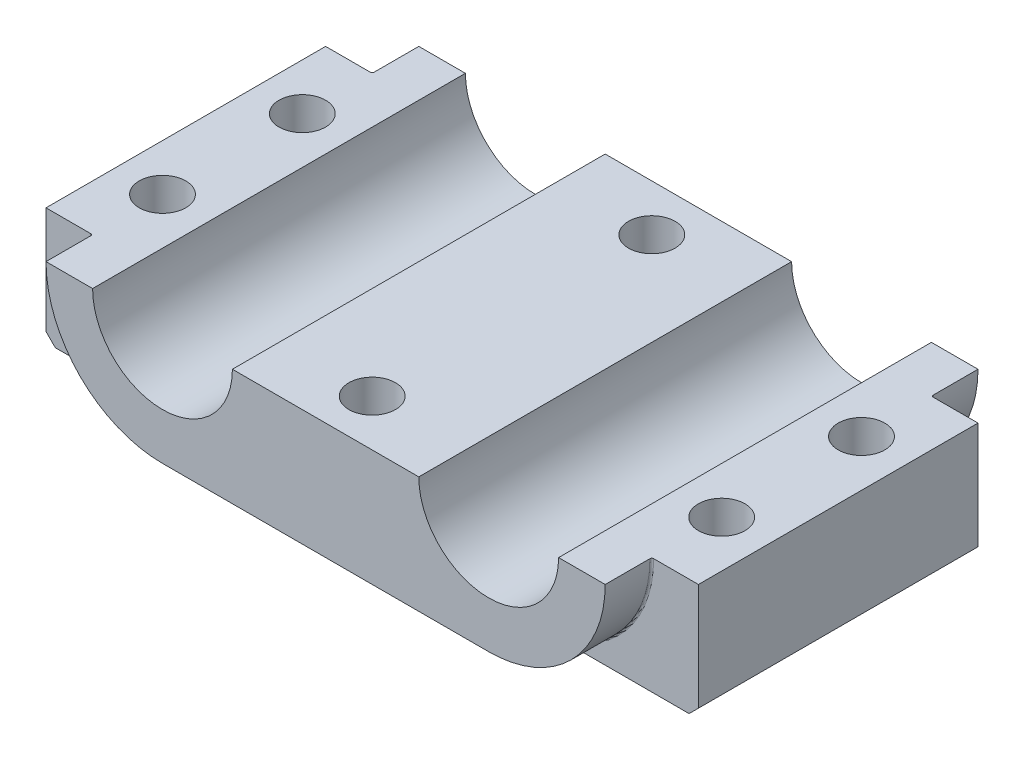
ISO-10303-21;
HEADER;
FILE_DESCRIPTION(('STEP AP214'),'2;1');
FILE_NAME('part.step','',(''),(''),'','','');
FILE_SCHEMA(('AUTOMOTIVE_DESIGN { 1 0 10303 214 1 1 1 1 }'));
ENDSEC;
DATA;
#1=APPLICATION_CONTEXT('core data for automotive mechanical design processes');
#2=APPLICATION_PROTOCOL_DEFINITION('international standard','automotive_design',2000,#1);
#3=PRODUCT_CONTEXT('',#1,'mechanical');
#4=PRODUCT('Part','Part','',(#3));
#5=PRODUCT_RELATED_PRODUCT_CATEGORY('part','',(#4));
#6=PRODUCT_DEFINITION_FORMATION('','',#4);
#7=PRODUCT_DEFINITION_CONTEXT('part definition',#1,'design');
#8=PRODUCT_DEFINITION('design','',#6,#7);
#9=PRODUCT_DEFINITION_SHAPE('','',#8);
#10=(LENGTH_UNIT() NAMED_UNIT(*) SI_UNIT(.MILLI.,.METRE.));
#11=(NAMED_UNIT(*) PLANE_ANGLE_UNIT() SI_UNIT($,.RADIAN.));
#12=(NAMED_UNIT(*) SI_UNIT($,.STERADIAN.) SOLID_ANGLE_UNIT());
#13=UNCERTAINTY_MEASURE_WITH_UNIT(LENGTH_MEASURE(1.E-05),#10,'distance_accuracy_value','');
#14=(GEOMETRIC_REPRESENTATION_CONTEXT(3) GLOBAL_UNCERTAINTY_ASSIGNED_CONTEXT((#13)) GLOBAL_UNIT_ASSIGNED_CONTEXT((#10,
#11,#12)) REPRESENTATION_CONTEXT('',''));
#15=CARTESIAN_POINT('',(0.,0.,0.));
#16=DIRECTION('',(0.,0.,1.));
#17=DIRECTION('',(1.,0.,0.));
#18=AXIS2_PLACEMENT_3D('',#15,#16,#17);
#19=CARTESIAN_POINT('',(17.5,-12.5,-20.));
#20=DIRECTION('',(0.,-1.,0.));
#21=DIRECTION('',(0.,0.,-1.));
#22=AXIS2_PLACEMENT_3D('',#19,#20,#21);
#23=PLANE('',#22);
#24=CARTESIAN_POINT('',(0.,-12.5,-15.));
#25=DIRECTION('',(0.,1.,0.));
#26=DIRECTION('',(0.,0.,1.));
#27=AXIS2_PLACEMENT_3D('',#24,#25,#26);
#28=CIRCLE('',#27,2.5);
#29=CARTESIAN_POINT('',(0.,-12.5,-12.5));
#30=VERTEX_POINT('',#29);
#31=EDGE_CURVE('E480',#30,#30,#28,.T.);
#32=ORIENTED_EDGE('',*,*,#31,.T.);
#33=EDGE_LOOP('',(#32));
#34=FACE_BOUND('',#33,.T.);
#35=CARTESIAN_POINT('',(0.,-12.5,15.));
#36=DIRECTION('',(0.,1.,0.));
#37=DIRECTION('',(0.,0.,1.));
#38=AXIS2_PLACEMENT_3D('',#35,#36,#37);
#39=CIRCLE('',#38,2.5);
#40=CARTESIAN_POINT('',(0.,-12.5,17.5));
#41=VERTEX_POINT('',#40);
#42=EDGE_CURVE('E484',#41,#41,#39,.T.);
#43=ORIENTED_EDGE('',*,*,#42,.T.);
#44=EDGE_LOOP('',(#43));
#45=FACE_BOUND('',#44,.T.);
#46=CARTESIAN_POINT('',(-30.,-12.5,7.50000000000003));
#47=DIRECTION('',(0.,1.,0.));
#48=DIRECTION('',(0.,0.,1.));
#49=AXIS2_PLACEMENT_3D('',#46,#47,#48);
#50=CIRCLE('',#49,2.5);
#51=CARTESIAN_POINT('',(-30.,-12.5,10.));
#52=VERTEX_POINT('',#51);
#53=EDGE_CURVE('E488',#52,#52,#50,.T.);
#54=ORIENTED_EDGE('',*,*,#53,.T.);
#55=EDGE_LOOP('',(#54));
#56=FACE_BOUND('',#55,.T.);
#57=CARTESIAN_POINT('',(30.,-12.5,7.50000000000003));
#58=DIRECTION('',(0.,1.,0.));
#59=DIRECTION('',(0.,0.,1.));
#60=AXIS2_PLACEMENT_3D('',#57,#58,#59);
#61=CIRCLE('',#60,2.5);
#62=CARTESIAN_POINT('',(30.,-12.5,10.));
#63=VERTEX_POINT('',#62);
#64=EDGE_CURVE('E214',#63,#63,#61,.T.);
#65=ORIENTED_EDGE('',*,*,#64,.T.);
#66=EDGE_LOOP('',(#65));
#67=FACE_BOUND('',#66,.T.);
#68=DIRECTION('',(1.,0.,0.));
#69=VECTOR('',#68,1.);
#70=CARTESIAN_POINT('',(-35.,-12.5,15.));
#71=LINE('',#70,#69);
#72=CARTESIAN_POINT('',(-34.,-12.5,15.));
#73=VERTEX_POINT('',#72);
#74=CARTESIAN_POINT('',(-19.7449944320644,-12.5,15.));
#75=VERTEX_POINT('',#74);
#76=EDGE_CURVE('E236',#73,#75,#71,.T.);
#77=ORIENTED_EDGE('',*,*,#76,.F.);
#78=DIRECTION('',(0.,0.,-1.));
#79=VECTOR('',#78,1.);
#80=CARTESIAN_POINT('',(-34.,-12.5,-20.));
#81=LINE('',#80,#79);
#82=CARTESIAN_POINT('',(-34.,-12.5,-15.));
#83=VERTEX_POINT('',#82);
#84=EDGE_CURVE('E332',#73,#83,#81,.T.);
#85=ORIENTED_EDGE('',*,*,#84,.T.);
#86=DIRECTION('',(1.,0.,0.));
#87=VECTOR('',#86,1.);
#88=CARTESIAN_POINT('',(-35.,-12.5,-15.));
#89=LINE('',#88,#87);
#90=CARTESIAN_POINT('',(-19.7449944320644,-12.5,-15.));
#91=VERTEX_POINT('',#90);
#92=EDGE_CURVE('E224',#83,#91,#89,.T.);
#93=ORIENTED_EDGE('',*,*,#92,.T.);
#94=CARTESIAN_POINT('',(-19.7449944320644,-12.5,-15.));
#95=CARTESIAN_POINT('',(-19.6782740769426,-12.5,-15.0000206450152));
#96=CARTESIAN_POINT('',(-19.6115646343148,-12.5,-15.0010401287033));
#97=CARTESIAN_POINT('',(-19.4782238795266,-12.5,-15.0047274040747));
#98=CARTESIAN_POINT('',(-19.4115925448792,-12.5,-15.0073943561905));
#99=CARTESIAN_POINT('',(-19.2116887270352,-12.5,-15.0173501691869));
#100=CARTESIAN_POINT('',(-19.0785161278774,-12.5,-15.0265928090738));
#101=CARTESIAN_POINT('',(-18.8124532512302,-12.5,-15.0485626730138));
#102=CARTESIAN_POINT('',(-18.6795630249036,-12.5,-15.0612904819402));
#103=CARTESIAN_POINT('',(-18.2811128526412,-12.5,-15.1028860141954));
#104=CARTESIAN_POINT('',(-18.01591794903,-12.5,-15.1351557236991));
#105=CARTESIAN_POINT('',(-17.6746293629451,-12.5,-15.1779224548599));
#106=CARTESIAN_POINT('',(-17.5984064291438,-12.5,-15.1875534799209));
#107=CARTESIAN_POINT('',(-17.514789280387,-12.5,-15.1981292657569));
#108=CARTESIAN_POINT('',(-17.5073946433153,-12.5,-15.1990646195097));
#109=CARTESIAN_POINT('',(-17.5,-12.5,-15.2));
#110=B_SPLINE_CURVE_WITH_KNOTS('',3,(#94,#95,#96,#97,#98,#99,#100,#101,#102,#103,#104,#105,#106,
#107,#108,#109),.UNSPECIFIED.,.F.,.F.,(4,2,2,2,2,2,2,4),(0.,0.200137937227426,0.400173966043829,
0.800574859185558,1.20104298792152,2.00241361528082,2.23290310987466,2.25526378964976),.UNSPECIFIED.);
#111=CARTESIAN_POINT('',(-17.5,-12.5,-15.2));
#112=VERTEX_POINT('',#111);
#113=EDGE_CURVE('E370',#91,#112,#110,.T.);
#114=ORIENTED_EDGE('',*,*,#113,.T.);
#115=DIRECTION('',(0.,0.,1.));
#116=VECTOR('',#115,1.);
#117=CARTESIAN_POINT('',(-17.5,-12.5,-20.));
#118=LINE('',#117,#116);
#119=CARTESIAN_POINT('',(-17.5,-12.5,-20.));
#120=VERTEX_POINT('',#119);
#121=EDGE_CURVE('E322',#120,#112,#118,.T.);
#122=ORIENTED_EDGE('',*,*,#121,.F.);
#123=DIRECTION('',(1.,0.,0.));
#124=VECTOR('',#123,1.);
#125=CARTESIAN_POINT('',(17.5,-12.5,-20.));
#126=LINE('',#125,#124);
#127=CARTESIAN_POINT('',(17.5,-12.5,-20.));
#128=VERTEX_POINT('',#127);
#129=EDGE_CURVE('E279',#120,#128,#126,.T.);
#130=ORIENTED_EDGE('',*,*,#129,.T.);
#131=DIRECTION('',(0.,0.,1.));
#132=VECTOR('',#131,1.);
#133=CARTESIAN_POINT('',(17.5,-12.5,-20.));
#134=LINE('',#133,#132);
#135=CARTESIAN_POINT('',(17.5,-12.5,-15.2));
#136=VERTEX_POINT('',#135);
#137=EDGE_CURVE('E318',#128,#136,#134,.T.);
#138=ORIENTED_EDGE('',*,*,#137,.T.);
#139=CARTESIAN_POINT('',(19.7449944320644,-12.5,-15.));
#140=CARTESIAN_POINT('',(19.6782740769426,-12.5,-15.0000206450152));
#141=CARTESIAN_POINT('',(19.6115646343147,-12.5,-15.0010401287033));
#142=CARTESIAN_POINT('',(19.4782238795266,-12.5,-15.0047274040747));
#143=CARTESIAN_POINT('',(19.4115925448792,-12.5,-15.0073943561905));
#144=CARTESIAN_POINT('',(19.2116887270352,-12.5,-15.0173501691869));
#145=CARTESIAN_POINT('',(19.0785161278774,-12.5,-15.0265928090738));
#146=CARTESIAN_POINT('',(18.8124532512302,-12.5,-15.0485626730138));
#147=CARTESIAN_POINT('',(18.6795630249036,-12.5,-15.0612904819402));
#148=CARTESIAN_POINT('',(18.2811128526412,-12.5,-15.1028860141954));
#149=CARTESIAN_POINT('',(18.01591794903,-12.5,-15.1351557236991));
#150=CARTESIAN_POINT('',(17.6746293629451,-12.5,-15.1779224548599));
#151=CARTESIAN_POINT('',(17.5984064291438,-12.5,-15.1875534799209));
#152=CARTESIAN_POINT('',(17.514789280387,-12.5,-15.1981292657569));
#153=CARTESIAN_POINT('',(17.5073946433153,-12.5,-15.1990646195097));
#154=CARTESIAN_POINT('',(17.5,-12.5,-15.2));
#155=B_SPLINE_CURVE_WITH_KNOTS('',3,(#139,#140,#141,#142,#143,#144,#145,#146,#147,#148,#149,
#150,#151,#152,#153,#154),.UNSPECIFIED.,.F.,.F.,(4,2,2,2,2,2,2,4),(0.,0.200137937227426,
0.400173966043826,0.800574859185555,1.20104298792152,2.00241361528082,2.23290310987462,
2.25526378964973),.UNSPECIFIED.);
#156=CARTESIAN_POINT('',(19.7449944320644,-12.5,-15.));
#157=VERTEX_POINT('',#156);
#158=EDGE_CURVE('E363',#136,#157,#155,.F.);
#159=ORIENTED_EDGE('',*,*,#158,.T.);
#160=CARTESIAN_POINT('',(34.,-12.5,-15.));
#161=VERTEX_POINT('',#160);
#162=EDGE_CURVE('E247',#157,#161,#89,.T.);
#163=ORIENTED_EDGE('',*,*,#162,.T.);
#164=DIRECTION('',(0.,0.,1.));
#165=VECTOR('',#164,1.);
#166=CARTESIAN_POINT('',(34.,-12.5,-20.));
#167=LINE('',#166,#165);
#168=CARTESIAN_POINT('',(34.,-12.5,15.));
#169=VERTEX_POINT('',#168);
#170=EDGE_CURVE('E329',#161,#169,#167,.T.);
#171=ORIENTED_EDGE('',*,*,#170,.T.);
#172=CARTESIAN_POINT('',(19.7449944320644,-12.5,15.));
#173=VERTEX_POINT('',#172);
#174=EDGE_CURVE('E235',#173,#169,#71,.T.);
#175=ORIENTED_EDGE('',*,*,#174,.F.);
#176=CARTESIAN_POINT('',(19.7449944320644,-12.5,15.));
#177=CARTESIAN_POINT('',(19.6782740769426,-12.5,15.0000206450153));
#178=CARTESIAN_POINT('',(19.6115646343147,-12.5,15.0010401287033));
#179=CARTESIAN_POINT('',(19.4782238795266,-12.5,15.0047274040748));
#180=CARTESIAN_POINT('',(19.4115925448792,-12.5,15.0073943561905));
#181=CARTESIAN_POINT('',(19.2116887270352,-12.5,15.017350169187));
#182=CARTESIAN_POINT('',(19.0785161278774,-12.5,15.0265928090738));
#183=CARTESIAN_POINT('',(18.8124532512302,-12.5,15.0485626730139));
#184=CARTESIAN_POINT('',(18.6795630249036,-12.5,15.0612904819402));
#185=CARTESIAN_POINT('',(18.2811128526412,-12.5,15.1028860141954));
#186=CARTESIAN_POINT('',(18.01591794903,-12.5,15.1351557236991));
#187=CARTESIAN_POINT('',(17.6746293629451,-12.5,15.17792245486));
#188=CARTESIAN_POINT('',(17.5984064291438,-12.5,15.1875534799209));
#189=CARTESIAN_POINT('',(17.514789280387,-12.5,15.1981292657569));
#190=CARTESIAN_POINT('',(17.5073946433153,-12.5,15.1990646195097));
#191=CARTESIAN_POINT('',(17.5,-12.5,15.2));
#192=B_SPLINE_CURVE_WITH_KNOTS('',3,(#176,#177,#178,#179,#180,#181,#182,#183,#184,#185,#186,
#187,#188,#189,#190,#191),.UNSPECIFIED.,.F.,.F.,(4,2,2,2,2,2,2,4),(0.,0.200137937227423,
0.400173966043826,0.800574859185558,1.20104298792152,2.00241361528082,2.23290310987462,
2.25526378964973),.UNSPECIFIED.);
#193=CARTESIAN_POINT('',(17.5,-12.5,15.2));
#194=VERTEX_POINT('',#193);
#195=EDGE_CURVE('E13',#173,#194,#192,.T.);
#196=ORIENTED_EDGE('',*,*,#195,.T.);
#197=CARTESIAN_POINT('',(17.5,-12.5,20.));
#198=VERTEX_POINT('',#197);
#199=EDGE_CURVE('E321',#194,#198,#134,.T.);
#200=ORIENTED_EDGE('',*,*,#199,.T.);
#201=DIRECTION('',(1.,0.,0.));
#202=VECTOR('',#201,1.);
#203=CARTESIAN_POINT('',(17.5,-12.5,20.));
#204=LINE('',#203,#202);
#205=CARTESIAN_POINT('',(-17.5,-12.5,20.));
#206=VERTEX_POINT('',#205);
#207=EDGE_CURVE('E255',#206,#198,#204,.T.);
#208=ORIENTED_EDGE('',*,*,#207,.F.);
#209=CARTESIAN_POINT('',(-17.5,-12.5,15.2));
#210=VERTEX_POINT('',#209);
#211=EDGE_CURVE('E300',#210,#206,#118,.T.);
#212=ORIENTED_EDGE('',*,*,#211,.F.);
#213=CARTESIAN_POINT('',(-19.7449944320644,-12.5,15.));
#214=CARTESIAN_POINT('',(-19.6782740769426,-12.5,15.0000206450153));
#215=CARTESIAN_POINT('',(-19.6115646343148,-12.5,15.0010401287033));
#216=CARTESIAN_POINT('',(-19.4782238795266,-12.5,15.0047274040748));
#217=CARTESIAN_POINT('',(-19.4115925448792,-12.5,15.0073943561905));
#218=CARTESIAN_POINT('',(-19.2116887270352,-12.5,15.0173501691869));
#219=CARTESIAN_POINT('',(-19.0785161278774,-12.5,15.0265928090738));
#220=CARTESIAN_POINT('',(-18.8124532512302,-12.5,15.0485626730139));
#221=CARTESIAN_POINT('',(-18.6795630249036,-12.5,15.0612904819402));
#222=CARTESIAN_POINT('',(-18.2811128526412,-12.5,15.1028860141954));
#223=CARTESIAN_POINT('',(-18.01591794903,-12.5,15.1351557236991));
#224=CARTESIAN_POINT('',(-17.6746293629451,-12.5,15.17792245486));
#225=CARTESIAN_POINT('',(-17.5984064291438,-12.5,15.1875534799209));
#226=CARTESIAN_POINT('',(-17.514789280387,-12.5,15.1981292657569));
#227=CARTESIAN_POINT('',(-17.5073946433153,-12.5,15.1990646195097));
#228=CARTESIAN_POINT('',(-17.5,-12.5,15.2));
#229=B_SPLINE_CURVE_WITH_KNOTS('',3,(#213,#214,#215,#216,#217,#218,#219,#220,#221,#222,#223,
#224,#225,#226,#227,#228),.UNSPECIFIED.,.F.,.F.,(4,2,2,2,2,2,2,4),(0.,0.200137937227426,
0.400173966043829,0.800574859185558,1.20104298792152,2.00241361528082,2.23290310987466,
2.25526378964976),.UNSPECIFIED.);
#230=EDGE_CURVE('E398',#210,#75,#229,.F.);
#231=ORIENTED_EDGE('',*,*,#230,.T.);
#232=EDGE_LOOP('',(#77,#85,#93,#114,#122,#130,#138,#159,#163,#171,#175,#196,#200,#208,#212,#231));
#233=FACE_BOUND('',#232,.T.);
#234=CARTESIAN_POINT('',(30.,-12.5,-7.50000000000001));
#235=DIRECTION('',(0.,1.,0.));
#236=DIRECTION('',(0.,0.,1.));
#237=AXIS2_PLACEMENT_3D('',#234,#235,#236);
#238=CIRCLE('',#237,2.5);
#239=CARTESIAN_POINT('',(30.,-12.5,-5.00000000000001));
#240=VERTEX_POINT('',#239);
#241=EDGE_CURVE('E494',#240,#240,#238,.T.);
#242=ORIENTED_EDGE('',*,*,#241,.T.);
#243=EDGE_LOOP('',(#242));
#244=FACE_BOUND('',#243,.T.);
#245=CARTESIAN_POINT('',(-30.,-12.5,-7.50000000000001));
#246=DIRECTION('',(0.,1.,0.));
#247=DIRECTION('',(0.,0.,1.));
#248=AXIS2_PLACEMENT_3D('',#245,#246,#247);
#249=CIRCLE('',#248,2.5);
#250=CARTESIAN_POINT('',(-30.,-12.5,-5.00000000000001));
#251=VERTEX_POINT('',#250);
#252=EDGE_CURVE('E502',#251,#251,#249,.T.);
#253=ORIENTED_EDGE('',*,*,#252,.T.);
#254=EDGE_LOOP('',(#253));
#255=FACE_BOUND('',#254,.T.);
#256=ADVANCED_FACE('F54',(#34,#45,#56,#67,#233,#244,#255),#23,.T.);
#257=CARTESIAN_POINT('',(-17.5,0.,-20.));
#258=DIRECTION('',(0.,0.,1.));
#259=DIRECTION('',(1.,0.,0.));
#260=AXIS2_PLACEMENT_3D('',#257,#258,#259);
#261=CYLINDRICAL_SURFACE('',#260,12.5);
#262=DIRECTION('',(0.,0.,1.));
#263=VECTOR('',#262,1.);
#264=CARTESIAN_POINT('',(-30.,0.,-20.));
#265=LINE('',#264,#263);
#266=CARTESIAN_POINT('',(-30.,0.,15.2));
#267=VERTEX_POINT('',#266);
#268=CARTESIAN_POINT('',(-30.,0.,20.));
#269=VERTEX_POINT('',#268);
#270=EDGE_CURVE('E305',#267,#269,#265,.T.);
#271=ORIENTED_EDGE('',*,*,#270,.F.);
#272=CARTESIAN_POINT('',(-17.5,0.,15.2));
#273=DIRECTION('',(0.,0.,-1.));
#274=DIRECTION('',(-1.,0.,0.));
#275=AXIS2_PLACEMENT_3D('',#272,#273,#274);
#276=CIRCLE('',#275,12.5);
#277=EDGE_CURVE('E352',#267,#210,#276,.F.);
#278=ORIENTED_EDGE('',*,*,#277,.T.);
#279=ORIENTED_EDGE('',*,*,#211,.T.);
#280=CARTESIAN_POINT('',(-17.5,0.,20.));
#281=DIRECTION('',(0.,0.,1.));
#282=DIRECTION('',(-1.,0.,0.));
#283=AXIS2_PLACEMENT_3D('',#280,#281,#282);
#284=CIRCLE('',#283,12.5);
#285=EDGE_CURVE('E251',#269,#206,#284,.T.);
#286=ORIENTED_EDGE('',*,*,#285,.F.);
#287=EDGE_LOOP('',(#271,#278,#279,#286));
#288=FACE_BOUND('',#287,.T.);
#289=ADVANCED_FACE('F416',(#288),#261,.T.);
#290=CARTESIAN_POINT('',(17.5,0.,-20.));
#291=DIRECTION('',(0.,0.,1.));
#292=DIRECTION('',(1.,0.,0.));
#293=AXIS2_PLACEMENT_3D('',#290,#291,#292);
#294=CYLINDRICAL_SURFACE('',#293,12.5);
#295=ORIENTED_EDGE('',*,*,#199,.F.);
#296=CARTESIAN_POINT('',(17.5,0.,15.2));
#297=DIRECTION('',(0.,0.,-1.));
#298=DIRECTION('',(-1.,0.,0.));
#299=AXIS2_PLACEMENT_3D('',#296,#297,#298);
#300=CIRCLE('',#299,12.5);
#301=CARTESIAN_POINT('',(30.,0.,15.2));
#302=VERTEX_POINT('',#301);
#303=EDGE_CURVE('E357',#194,#302,#300,.F.);
#304=ORIENTED_EDGE('',*,*,#303,.T.);
#305=DIRECTION('',(0.,0.,1.));
#306=VECTOR('',#305,1.);
#307=CARTESIAN_POINT('',(30.,0.,-20.));
#308=LINE('',#307,#306);
#309=CARTESIAN_POINT('',(30.,0.,20.));
#310=VERTEX_POINT('',#309);
#311=EDGE_CURVE('E317',#302,#310,#308,.T.);
#312=ORIENTED_EDGE('',*,*,#311,.T.);
#313=CARTESIAN_POINT('',(17.5,0.,20.));
#314=DIRECTION('',(0.,0.,1.));
#315=DIRECTION('',(1.,0.,0.));
#316=AXIS2_PLACEMENT_3D('',#313,#314,#315);
#317=CIRCLE('',#316,12.5);
#318=EDGE_CURVE('E258',#198,#310,#317,.T.);
#319=ORIENTED_EDGE('',*,*,#318,.F.);
#320=EDGE_LOOP('',(#295,#304,#312,#319));
#321=FACE_BOUND('',#320,.T.);
#322=ADVANCED_FACE('F460',(#321),#294,.T.);
#323=ORIENTED_EDGE('',*,*,#121,.T.);
#324=CARTESIAN_POINT('',(-17.5,0.,-15.2));
#325=DIRECTION('',(0.,0.,-1.));
#326=DIRECTION('',(-1.,0.,0.));
#327=AXIS2_PLACEMENT_3D('',#324,#325,#326);
#328=CIRCLE('',#327,12.5);
#329=CARTESIAN_POINT('',(-30.,0.,-15.2));
#330=VERTEX_POINT('',#329);
#331=EDGE_CURVE('E350',#112,#330,#328,.T.);
#332=ORIENTED_EDGE('',*,*,#331,.T.);
#333=CARTESIAN_POINT('',(-30.,0.,-20.));
#334=VERTEX_POINT('',#333);
#335=EDGE_CURVE('E301',#334,#330,#265,.T.);
#336=ORIENTED_EDGE('',*,*,#335,.F.);
#337=CARTESIAN_POINT('',(-17.5,0.,-20.));
#338=DIRECTION('',(0.,0.,1.));
#339=DIRECTION('',(-1.,0.,0.));
#340=AXIS2_PLACEMENT_3D('',#337,#338,#339);
#341=CIRCLE('',#340,12.5);
#342=EDGE_CURVE('E276',#334,#120,#341,.T.);
#343=ORIENTED_EDGE('',*,*,#342,.T.);
#344=EDGE_LOOP('',(#323,#332,#336,#343));
#345=FACE_BOUND('',#344,.T.);
#346=ADVANCED_FACE('F442',(#345),#261,.T.);
#347=CARTESIAN_POINT('',(-25.,0.,-20.));
#348=DIRECTION('',(0.,1.,0.));
#349=DIRECTION('',(0.,0.,1.));
#350=AXIS2_PLACEMENT_3D('',#347,#348,#349);
#351=PLANE('',#350);
#352=CARTESIAN_POINT('',(-30.,0.,7.50000000000003));
#353=DIRECTION('',(0.,1.,0.));
#354=DIRECTION('',(0.,0.,1.));
#355=AXIS2_PLACEMENT_3D('',#352,#353,#354);
#356=CIRCLE('',#355,2.49999999999999);
#357=CARTESIAN_POINT('',(-30.,0.,10.));
#358=VERTEX_POINT('',#357);
#359=EDGE_CURVE('E509',#358,#358,#356,.T.);
#360=ORIENTED_EDGE('',*,*,#359,.F.);
#361=EDGE_LOOP('',(#360));
#362=FACE_BOUND('',#361,.T.);
#363=CARTESIAN_POINT('',(-30.,0.,-7.50000000000001));
#364=DIRECTION('',(0.,1.,0.));
#365=DIRECTION('',(0.,0.,1.));
#366=AXIS2_PLACEMENT_3D('',#363,#364,#365);
#367=CIRCLE('',#366,2.49999999999999);
#368=CARTESIAN_POINT('',(-30.,0.,-5.00000000000002));
#369=VERTEX_POINT('',#368);
#370=EDGE_CURVE('E505',#369,#369,#367,.T.);
#371=ORIENTED_EDGE('',*,*,#370,.F.);
#372=EDGE_LOOP('',(#371));
#373=FACE_BOUND('',#372,.T.);
#374=ORIENTED_EDGE('',*,*,#335,.T.);
#375=CARTESIAN_POINT('',(-30.2,0.,-15.2));
#376=DIRECTION('',(0.,1.,0.));
#377=DIRECTION('',(0.,0.,1.));
#378=AXIS2_PLACEMENT_3D('',#375,#376,#377);
#379=CIRCLE('',#378,0.2);
#380=CARTESIAN_POINT('',(-30.2,0.,-15.));
#381=VERTEX_POINT('',#380);
#382=EDGE_CURVE('E405',#330,#381,#379,.F.);
#383=ORIENTED_EDGE('',*,*,#382,.T.);
#384=DIRECTION('',(-1.,0.,0.));
#385=VECTOR('',#384,1.);
#386=CARTESIAN_POINT('',(-25.,0.,-15.));
#387=LINE('',#386,#385);
#388=CARTESIAN_POINT('',(-35.,0.,-15.));
#389=VERTEX_POINT('',#388);
#390=EDGE_CURVE('E242',#381,#389,#387,.T.);
#391=ORIENTED_EDGE('',*,*,#390,.T.);
#392=DIRECTION('',(0.,0.,1.));
#393=VECTOR('',#392,1.);
#394=CARTESIAN_POINT('',(-35.,0.,-15.));
#395=LINE('',#394,#393);
#396=CARTESIAN_POINT('',(-35.,0.,15.));
#397=VERTEX_POINT('',#396);
#398=EDGE_CURVE('E223',#389,#397,#395,.T.);
#399=ORIENTED_EDGE('',*,*,#398,.T.);
#400=DIRECTION('',(-1.,0.,0.));
#401=VECTOR('',#400,1.);
#402=CARTESIAN_POINT('',(-25.,0.,15.));
#403=LINE('',#402,#401);
#404=CARTESIAN_POINT('',(-30.2,0.,15.));
#405=VERTEX_POINT('',#404);
#406=EDGE_CURVE('E227',#405,#397,#403,.T.);
#407=ORIENTED_EDGE('',*,*,#406,.F.);
#408=CARTESIAN_POINT('',(-30.2,0.,15.2));
#409=DIRECTION('',(0.,1.,0.));
#410=DIRECTION('',(0.,0.,1.));
#411=AXIS2_PLACEMENT_3D('',#408,#409,#410);
#412=CIRCLE('',#411,0.2);
#413=EDGE_CURVE('E404',#405,#267,#412,.F.);
#414=ORIENTED_EDGE('',*,*,#413,.T.);
#415=ORIENTED_EDGE('',*,*,#270,.T.);
#416=DIRECTION('',(-1.,0.,0.));
#417=VECTOR('',#416,1.);
#418=CARTESIAN_POINT('',(-25.,0.,20.));
#419=LINE('',#418,#417);
#420=CARTESIAN_POINT('',(-25.,0.,20.));
#421=VERTEX_POINT('',#420);
#422=EDGE_CURVE('E273',#421,#269,#419,.T.);
#423=ORIENTED_EDGE('',*,*,#422,.F.);
#424=DIRECTION('',(0.,0.,1.));
#425=VECTOR('',#424,1.);
#426=CARTESIAN_POINT('',(-25.,0.,-20.));
#427=LINE('',#426,#425);
#428=CARTESIAN_POINT('',(-25.,0.,-20.));
#429=VERTEX_POINT('',#428);
#430=EDGE_CURVE('E306',#429,#421,#427,.T.);
#431=ORIENTED_EDGE('',*,*,#430,.F.);
#432=DIRECTION('',(-1.,0.,0.));
#433=VECTOR('',#432,1.);
#434=CARTESIAN_POINT('',(-25.,0.,-20.));
#435=LINE('',#434,#433);
#436=EDGE_CURVE('E297',#429,#334,#435,.T.);
#437=ORIENTED_EDGE('',*,*,#436,.T.);
#438=EDGE_LOOP('',(#374,#383,#391,#399,#407,#414,#415,#423,#431,#437));
#439=FACE_BOUND('',#438,.T.);
#440=ADVANCED_FACE('F410',(#362,#373,#439),#351,.T.);
#441=CARTESIAN_POINT('',(-17.5,0.,-20.));
#442=DIRECTION('',(0.,0.,1.));
#443=DIRECTION('',(1.,0.,0.));
#444=AXIS2_PLACEMENT_3D('',#441,#442,#443);
#445=CYLINDRICAL_SURFACE('',#444,7.5);
#446=ORIENTED_EDGE('',*,*,#430,.T.);
#447=CARTESIAN_POINT('',(-17.5,0.,20.));
#448=DIRECTION('',(0.,0.,-1.));
#449=DIRECTION('',(-1.,0.,0.));
#450=AXIS2_PLACEMENT_3D('',#447,#448,#449);
#451=CIRCLE('',#450,7.5);
#452=CARTESIAN_POINT('',(-10.,0.,20.));
#453=VERTEX_POINT('',#452);
#454=EDGE_CURVE('E270',#453,#421,#451,.T.);
#455=ORIENTED_EDGE('',*,*,#454,.F.);
#456=DIRECTION('',(0.,0.,1.));
#457=VECTOR('',#456,1.);
#458=CARTESIAN_POINT('',(-10.,0.,-20.));
#459=LINE('',#458,#457);
#460=CARTESIAN_POINT('',(-10.,0.,-20.));
#461=VERTEX_POINT('',#460);
#462=EDGE_CURVE('E308',#461,#453,#459,.T.);
#463=ORIENTED_EDGE('',*,*,#462,.F.);
#464=CARTESIAN_POINT('',(-17.5,0.,-20.));
#465=DIRECTION('',(0.,0.,-1.));
#466=DIRECTION('',(-1.,0.,0.));
#467=AXIS2_PLACEMENT_3D('',#464,#465,#466);
#468=CIRCLE('',#467,7.5);
#469=EDGE_CURVE('E294',#461,#429,#468,.T.);
#470=ORIENTED_EDGE('',*,*,#469,.T.);
#471=EDGE_LOOP('',(#446,#455,#463,#470));
#472=FACE_BOUND('',#471,.T.);
#473=ADVANCED_FACE('F525',(#472),#445,.F.);
#474=CARTESIAN_POINT('',(-10.,0.,-20.));
#475=DIRECTION('',(0.,1.,0.));
#476=DIRECTION('',(0.,0.,1.));
#477=AXIS2_PLACEMENT_3D('',#474,#475,#476);
#478=PLANE('',#477);
#479=CARTESIAN_POINT('',(0.,0.,-15.));
#480=DIRECTION('',(0.,1.,0.));
#481=DIRECTION('',(0.,0.,1.));
#482=AXIS2_PLACEMENT_3D('',#479,#480,#481);
#483=CIRCLE('',#482,2.49999999999999);
#484=CARTESIAN_POINT('',(0.,0.,-12.5));
#485=VERTEX_POINT('',#484);
#486=EDGE_CURVE('E517',#485,#485,#483,.T.);
#487=ORIENTED_EDGE('',*,*,#486,.F.);
#488=EDGE_LOOP('',(#487));
#489=FACE_BOUND('',#488,.T.);
#490=CARTESIAN_POINT('',(0.,0.,15.));
#491=DIRECTION('',(0.,1.,0.));
#492=DIRECTION('',(0.,0.,1.));
#493=AXIS2_PLACEMENT_3D('',#490,#491,#492);
#494=CIRCLE('',#493,2.49999999999999);
#495=CARTESIAN_POINT('',(0.,0.,17.5));
#496=VERTEX_POINT('',#495);
#497=EDGE_CURVE('E513',#496,#496,#494,.T.);
#498=ORIENTED_EDGE('',*,*,#497,.F.);
#499=EDGE_LOOP('',(#498));
#500=FACE_BOUND('',#499,.T.);
#501=ORIENTED_EDGE('',*,*,#462,.T.);
#502=DIRECTION('',(-1.,0.,0.));
#503=VECTOR('',#502,1.);
#504=CARTESIAN_POINT('',(-10.,0.,20.));
#505=LINE('',#504,#503);
#506=CARTESIAN_POINT('',(10.,0.,20.));
#507=VERTEX_POINT('',#506);
#508=EDGE_CURVE('E267',#507,#453,#505,.T.);
#509=ORIENTED_EDGE('',*,*,#508,.F.);
#510=DIRECTION('',(0.,0.,1.));
#511=VECTOR('',#510,1.);
#512=CARTESIAN_POINT('',(10.,0.,-20.));
#513=LINE('',#512,#511);
#514=CARTESIAN_POINT('',(10.,0.,-20.));
#515=VERTEX_POINT('',#514);
#516=EDGE_CURVE('E310',#515,#507,#513,.T.);
#517=ORIENTED_EDGE('',*,*,#516,.F.);
#518=DIRECTION('',(-1.,0.,0.));
#519=VECTOR('',#518,1.);
#520=CARTESIAN_POINT('',(-10.,0.,-20.));
#521=LINE('',#520,#519);
#522=EDGE_CURVE('E291',#515,#461,#521,.T.);
#523=ORIENTED_EDGE('',*,*,#522,.T.);
#524=EDGE_LOOP('',(#501,#509,#517,#523));
#525=FACE_BOUND('',#524,.T.);
#526=ADVANCED_FACE('F522',(#489,#500,#525),#478,.T.);
#527=CARTESIAN_POINT('',(17.5,0.,-20.));
#528=DIRECTION('',(0.,0.,1.));
#529=DIRECTION('',(1.,0.,0.));
#530=AXIS2_PLACEMENT_3D('',#527,#528,#529);
#531=CYLINDRICAL_SURFACE('',#530,7.5);
#532=ORIENTED_EDGE('',*,*,#516,.T.);
#533=CARTESIAN_POINT('',(17.5,0.,20.));
#534=DIRECTION('',(0.,0.,-1.));
#535=DIRECTION('',(1.,0.,0.));
#536=AXIS2_PLACEMENT_3D('',#533,#534,#535);
#537=CIRCLE('',#536,7.5);
#538=CARTESIAN_POINT('',(25.,0.,20.));
#539=VERTEX_POINT('',#538);
#540=EDGE_CURVE('E264',#539,#507,#537,.T.);
#541=ORIENTED_EDGE('',*,*,#540,.F.);
#542=DIRECTION('',(0.,0.,1.));
#543=VECTOR('',#542,1.);
#544=CARTESIAN_POINT('',(25.,0.,-20.));
#545=LINE('',#544,#543);
#546=CARTESIAN_POINT('',(25.,0.,-20.));
#547=VERTEX_POINT('',#546);
#548=EDGE_CURVE('E312',#547,#539,#545,.T.);
#549=ORIENTED_EDGE('',*,*,#548,.F.);
#550=CARTESIAN_POINT('',(17.5,0.,-20.));
#551=DIRECTION('',(0.,0.,-1.));
#552=DIRECTION('',(1.,0.,0.));
#553=AXIS2_PLACEMENT_3D('',#550,#551,#552);
#554=CIRCLE('',#553,7.5);
#555=EDGE_CURVE('E288',#547,#515,#554,.T.);
#556=ORIENTED_EDGE('',*,*,#555,.T.);
#557=EDGE_LOOP('',(#532,#541,#549,#556));
#558=FACE_BOUND('',#557,.T.);
#559=ADVANCED_FACE('F467',(#558),#531,.F.);
#560=CARTESIAN_POINT('',(25.,0.,-20.));
#561=DIRECTION('',(0.,1.,0.));
#562=DIRECTION('',(0.,0.,1.));
#563=AXIS2_PLACEMENT_3D('',#560,#561,#562);
#564=PLANE('',#563);
#565=CARTESIAN_POINT('',(30.,0.,-7.50000000000001));
#566=DIRECTION('',(0.,1.,0.));
#567=DIRECTION('',(0.,0.,1.));
#568=AXIS2_PLACEMENT_3D('',#565,#566,#567);
#569=CIRCLE('',#568,2.49999999999999);
#570=CARTESIAN_POINT('',(30.,0.,-5.00000000000002));
#571=VERTEX_POINT('',#570);
#572=EDGE_CURVE('E499',#571,#571,#569,.T.);
#573=ORIENTED_EDGE('',*,*,#572,.F.);
#574=EDGE_LOOP('',(#573));
#575=FACE_BOUND('',#574,.T.);
#576=CARTESIAN_POINT('',(30.,0.,7.50000000000003));
#577=DIRECTION('',(0.,1.,0.));
#578=DIRECTION('',(0.,0.,1.));
#579=AXIS2_PLACEMENT_3D('',#576,#577,#578);
#580=CIRCLE('',#579,2.49999999999999);
#581=CARTESIAN_POINT('',(30.,0.,10.));
#582=VERTEX_POINT('',#581);
#583=EDGE_CURVE('E492',#582,#582,#580,.T.);
#584=ORIENTED_EDGE('',*,*,#583,.F.);
#585=EDGE_LOOP('',(#584));
#586=FACE_BOUND('',#585,.T.);
#587=ORIENTED_EDGE('',*,*,#548,.T.);
#588=DIRECTION('',(-1.,0.,0.));
#589=VECTOR('',#588,1.);
#590=CARTESIAN_POINT('',(25.,0.,20.));
#591=LINE('',#590,#589);
#592=EDGE_CURVE('E261',#310,#539,#591,.T.);
#593=ORIENTED_EDGE('',*,*,#592,.F.);
#594=ORIENTED_EDGE('',*,*,#311,.F.);
#595=CARTESIAN_POINT('',(30.2,0.,15.2));
#596=DIRECTION('',(0.,1.,0.));
#597=DIRECTION('',(0.,0.,1.));
#598=AXIS2_PLACEMENT_3D('',#595,#596,#597);
#599=CIRCLE('',#598,0.2);
#600=CARTESIAN_POINT('',(30.2,0.,15.));
#601=VERTEX_POINT('',#600);
#602=EDGE_CURVE('E68',#302,#601,#599,.F.);
#603=ORIENTED_EDGE('',*,*,#602,.T.);
#604=DIRECTION('',(-1.,0.,0.));
#605=VECTOR('',#604,1.);
#606=CARTESIAN_POINT('',(30.,0.,15.));
#607=LINE('',#606,#605);
#608=CARTESIAN_POINT('',(35.,0.,15.));
#609=VERTEX_POINT('',#608);
#610=EDGE_CURVE('E209',#609,#601,#607,.T.);
#611=ORIENTED_EDGE('',*,*,#610,.F.);
#612=DIRECTION('',(0.,0.,1.));
#613=VECTOR('',#612,1.);
#614=CARTESIAN_POINT('',(35.,0.,-15.));
#615=LINE('',#614,#613);
#616=CARTESIAN_POINT('',(35.,0.,-15.));
#617=VERTEX_POINT('',#616);
#618=EDGE_CURVE('E217',#617,#609,#615,.T.);
#619=ORIENTED_EDGE('',*,*,#618,.F.);
#620=DIRECTION('',(-1.,0.,0.));
#621=VECTOR('',#620,1.);
#622=CARTESIAN_POINT('',(30.,0.,-15.));
#623=LINE('',#622,#621);
#624=CARTESIAN_POINT('',(30.2,0.,-15.));
#625=VERTEX_POINT('',#624);
#626=EDGE_CURVE('E240',#617,#625,#623,.T.);
#627=ORIENTED_EDGE('',*,*,#626,.T.);
#628=CARTESIAN_POINT('',(30.2,0.,-15.2));
#629=DIRECTION('',(0.,1.,0.));
#630=DIRECTION('',(0.,0.,1.));
#631=AXIS2_PLACEMENT_3D('',#628,#629,#630);
#632=CIRCLE('',#631,0.2);
#633=CARTESIAN_POINT('',(30.,0.,-15.2));
#634=VERTEX_POINT('',#633);
#635=EDGE_CURVE('E361',#625,#634,#632,.F.);
#636=ORIENTED_EDGE('',*,*,#635,.T.);
#637=CARTESIAN_POINT('',(30.,0.,-20.));
#638=VERTEX_POINT('',#637);
#639=EDGE_CURVE('E314',#638,#634,#308,.T.);
#640=ORIENTED_EDGE('',*,*,#639,.F.);
#641=DIRECTION('',(-1.,0.,0.));
#642=VECTOR('',#641,1.);
#643=CARTESIAN_POINT('',(25.,0.,-20.));
#644=LINE('',#643,#642);
#645=EDGE_CURVE('E285',#638,#547,#644,.T.);
#646=ORIENTED_EDGE('',*,*,#645,.T.);
#647=EDGE_LOOP('',(#587,#593,#594,#603,#611,#619,#627,#636,#640,#646));
#648=FACE_BOUND('',#647,.T.);
#649=ADVANCED_FACE('F226',(#575,#586,#648),#564,.T.);
#650=ORIENTED_EDGE('',*,*,#639,.T.);
#651=CARTESIAN_POINT('',(17.5,0.,-15.2));
#652=DIRECTION('',(0.,0.,-1.));
#653=DIRECTION('',(-1.,0.,0.));
#654=AXIS2_PLACEMENT_3D('',#651,#652,#653);
#655=CIRCLE('',#654,12.5);
#656=EDGE_CURVE('E345',#634,#136,#655,.T.);
#657=ORIENTED_EDGE('',*,*,#656,.T.);
#658=ORIENTED_EDGE('',*,*,#137,.F.);
#659=CARTESIAN_POINT('',(17.5,0.,-20.));
#660=DIRECTION('',(0.,0.,1.));
#661=DIRECTION('',(1.,0.,0.));
#662=AXIS2_PLACEMENT_3D('',#659,#660,#661);
#663=CIRCLE('',#662,12.5);
#664=EDGE_CURVE('E282',#128,#638,#663,.T.);
#665=ORIENTED_EDGE('',*,*,#664,.T.);
#666=EDGE_LOOP('',(#650,#657,#658,#665));
#667=FACE_BOUND('',#666,.T.);
#668=ADVANCED_FACE('F458',(#667),#294,.T.);
#669=CARTESIAN_POINT('',(-17.5,0.,-20.));
#670=DIRECTION('',(0.,0.,-1.));
#671=DIRECTION('',(-1.,0.,0.));
#672=AXIS2_PLACEMENT_3D('',#669,#670,#671);
#673=PLANE('',#672);
#674=ORIENTED_EDGE('',*,*,#342,.F.);
#675=ORIENTED_EDGE('',*,*,#436,.F.);
#676=ORIENTED_EDGE('',*,*,#469,.F.);
#677=ORIENTED_EDGE('',*,*,#522,.F.);
#678=ORIENTED_EDGE('',*,*,#555,.F.);
#679=ORIENTED_EDGE('',*,*,#645,.F.);
#680=ORIENTED_EDGE('',*,*,#664,.F.);
#681=ORIENTED_EDGE('',*,*,#129,.F.);
#682=EDGE_LOOP('',(#674,#675,#676,#677,#678,#679,#680,#681));
#683=FACE_BOUND('',#682,.T.);
#684=ADVANCED_FACE('F447',(#683),#673,.T.);
#685=CARTESIAN_POINT('',(-17.5,0.,20.));
#686=DIRECTION('',(0.,0.,-1.));
#687=DIRECTION('',(-1.,0.,0.));
#688=AXIS2_PLACEMENT_3D('',#685,#686,#687);
#689=PLANE('',#688);
#690=ORIENTED_EDGE('',*,*,#285,.T.);
#691=ORIENTED_EDGE('',*,*,#207,.T.);
#692=ORIENTED_EDGE('',*,*,#318,.T.);
#693=ORIENTED_EDGE('',*,*,#592,.T.);
#694=ORIENTED_EDGE('',*,*,#540,.T.);
#695=ORIENTED_EDGE('',*,*,#508,.T.);
#696=ORIENTED_EDGE('',*,*,#454,.T.);
#697=ORIENTED_EDGE('',*,*,#422,.T.);
#698=EDGE_LOOP('',(#690,#691,#692,#693,#694,#695,#696,#697));
#699=FACE_BOUND('',#698,.T.);
#700=ADVANCED_FACE('F465',(#699),#689,.F.);
#701=CARTESIAN_POINT('',(35.,0.,-15.));
#702=DIRECTION('',(1.,0.,0.));
#703=DIRECTION('',(0.,0.,-1.));
#704=AXIS2_PLACEMENT_3D('',#701,#702,#703);
#705=PLANE('',#704);
#706=DIRECTION('',(0.,1.,0.));
#707=VECTOR('',#706,1.);
#708=CARTESIAN_POINT('',(35.,0.,15.));
#709=LINE('',#708,#707);
#710=CARTESIAN_POINT('',(35.,-11.5,15.));
#711=VERTEX_POINT('',#710);
#712=EDGE_CURVE('E206',#711,#609,#709,.T.);
#713=ORIENTED_EDGE('',*,*,#712,.F.);
#714=DIRECTION('',(0.,0.,-1.));
#715=VECTOR('',#714,1.);
#716=CARTESIAN_POINT('',(35.,-11.5,-15.));
#717=LINE('',#716,#715);
#718=CARTESIAN_POINT('',(35.,-11.5,-15.));
#719=VERTEX_POINT('',#718);
#720=EDGE_CURVE('E337',#711,#719,#717,.T.);
#721=ORIENTED_EDGE('',*,*,#720,.T.);
#722=DIRECTION('',(0.,1.,0.));
#723=VECTOR('',#722,1.);
#724=CARTESIAN_POINT('',(35.,0.,-15.));
#725=LINE('',#724,#723);
#726=EDGE_CURVE('E220',#719,#617,#725,.T.);
#727=ORIENTED_EDGE('',*,*,#726,.T.);
#728=ORIENTED_EDGE('',*,*,#618,.T.);
#729=EDGE_LOOP('',(#713,#721,#727,#728));
#730=FACE_BOUND('',#729,.T.);
#731=ADVANCED_FACE('F218',(#730),#705,.T.);
#732=CARTESIAN_POINT('',(-17.5,0.,15.));
#733=DIRECTION('',(0.,0.,-1.));
#734=DIRECTION('',(-1.,0.,0.));
#735=AXIS2_PLACEMENT_3D('',#732,#733,#734);
#736=PLANE('',#735);
#737=ORIENTED_EDGE('',*,*,#610,.T.);
#738=CARTESIAN_POINT('',(17.5,0.,15.));
#739=DIRECTION('',(0.,0.,-1.));
#740=DIRECTION('',(-1.,0.,0.));
#741=AXIS2_PLACEMENT_3D('',#738,#739,#740);
#742=CIRCLE('',#741,12.7);
#743=EDGE_CURVE('E81',#601,#173,#742,.T.);
#744=ORIENTED_EDGE('',*,*,#743,.T.);
#745=ORIENTED_EDGE('',*,*,#174,.T.);
#746=DIRECTION('',(-0.707106781186546,-0.70710678118655,0.));
#747=VECTOR('',#746,1.);
#748=CARTESIAN_POINT('',(34.,-12.5,15.));
#749=LINE('',#748,#747);
#750=EDGE_CURVE('E211',#169,#711,#749,.F.);
#751=ORIENTED_EDGE('',*,*,#750,.T.);
#752=ORIENTED_EDGE('',*,*,#712,.T.);
#753=EDGE_LOOP('',(#737,#744,#745,#751,#752));
#754=FACE_BOUND('',#753,.T.);
#755=ADVANCED_FACE('F208',(#754),#736,.F.);
#756=CARTESIAN_POINT('',(-17.5,0.,-15.));
#757=DIRECTION('',(0.,0.,-1.));
#758=DIRECTION('',(-1.,0.,0.));
#759=AXIS2_PLACEMENT_3D('',#756,#757,#758);
#760=PLANE('',#759);
#761=ORIENTED_EDGE('',*,*,#162,.F.);
#762=CARTESIAN_POINT('',(17.5,0.,-15.));
#763=DIRECTION('',(0.,0.,-1.));
#764=DIRECTION('',(-1.,0.,0.));
#765=AXIS2_PLACEMENT_3D('',#762,#763,#764);
#766=CIRCLE('',#765,12.7);
#767=EDGE_CURVE('E342',#157,#625,#766,.F.);
#768=ORIENTED_EDGE('',*,*,#767,.T.);
#769=ORIENTED_EDGE('',*,*,#626,.F.);
#770=ORIENTED_EDGE('',*,*,#726,.F.);
#771=DIRECTION('',(0.707106781186546,0.70710678118655,0.));
#772=VECTOR('',#771,1.);
#773=CARTESIAN_POINT('',(14.5000000000002,-32.,-15.));
#774=LINE('',#773,#772);
#775=EDGE_CURVE('E339',#719,#161,#774,.F.);
#776=ORIENTED_EDGE('',*,*,#775,.T.);
#777=EDGE_LOOP('',(#761,#768,#769,#770,#776));
#778=FACE_BOUND('',#777,.T.);
#779=ADVANCED_FACE('F457',(#778),#760,.T.);
#780=ORIENTED_EDGE('',*,*,#390,.F.);
#781=CARTESIAN_POINT('',(-17.5,0.,-15.));
#782=DIRECTION('',(0.,0.,-1.));
#783=DIRECTION('',(-1.,0.,0.));
#784=AXIS2_PLACEMENT_3D('',#781,#782,#783);
#785=CIRCLE('',#784,12.7);
#786=EDGE_CURVE('E347',#381,#91,#785,.F.);
#787=ORIENTED_EDGE('',*,*,#786,.T.);
#788=ORIENTED_EDGE('',*,*,#92,.F.);
#789=DIRECTION('',(0.707106781186553,-0.707106781186543,0.));
#790=VECTOR('',#789,1.);
#791=CARTESIAN_POINT('',(-31.9999999999999,-14.5000000000001,-15.));
#792=LINE('',#791,#790);
#793=CARTESIAN_POINT('',(-35.,-11.5,-15.));
#794=VERTEX_POINT('',#793);
#795=EDGE_CURVE('E334',#83,#794,#792,.F.);
#796=ORIENTED_EDGE('',*,*,#795,.T.);
#797=DIRECTION('',(0.,-1.,0.));
#798=VECTOR('',#797,1.);
#799=CARTESIAN_POINT('',(-35.,0.,-15.));
#800=LINE('',#799,#798);
#801=EDGE_CURVE('E244',#389,#794,#800,.T.);
#802=ORIENTED_EDGE('',*,*,#801,.F.);
#803=EDGE_LOOP('',(#780,#787,#788,#796,#802));
#804=FACE_BOUND('',#803,.T.);
#805=ADVANCED_FACE('F436',(#804),#760,.T.);
#806=ORIENTED_EDGE('',*,*,#76,.T.);
#807=CARTESIAN_POINT('',(-17.5,0.,15.));
#808=DIRECTION('',(0.,0.,-1.));
#809=DIRECTION('',(-1.,0.,0.));
#810=AXIS2_PLACEMENT_3D('',#807,#808,#809);
#811=CIRCLE('',#810,12.7);
#812=EDGE_CURVE('E355',#75,#405,#811,.T.);
#813=ORIENTED_EDGE('',*,*,#812,.T.);
#814=ORIENTED_EDGE('',*,*,#406,.T.);
#815=DIRECTION('',(0.,-1.,0.));
#816=VECTOR('',#815,1.);
#817=CARTESIAN_POINT('',(-35.,0.,15.));
#818=LINE('',#817,#816);
#819=CARTESIAN_POINT('',(-35.,-11.5,15.));
#820=VERTEX_POINT('',#819);
#821=EDGE_CURVE('E229',#397,#820,#818,.T.);
#822=ORIENTED_EDGE('',*,*,#821,.T.);
#823=DIRECTION('',(-0.707106781186553,0.707106781186543,0.));
#824=VECTOR('',#823,1.);
#825=CARTESIAN_POINT('',(-35.,-11.5,15.));
#826=LINE('',#825,#824);
#827=EDGE_CURVE('E327',#820,#73,#826,.F.);
#828=ORIENTED_EDGE('',*,*,#827,.T.);
#829=EDGE_LOOP('',(#806,#813,#814,#822,#828));
#830=FACE_BOUND('',#829,.T.);
#831=ADVANCED_FACE('F424',(#830),#736,.F.);
#832=CARTESIAN_POINT('',(-35.,0.,-15.));
#833=DIRECTION('',(-1.,0.,0.));
#834=DIRECTION('',(0.,0.,1.));
#835=AXIS2_PLACEMENT_3D('',#832,#833,#834);
#836=PLANE('',#835);
#837=ORIENTED_EDGE('',*,*,#801,.T.);
#838=DIRECTION('',(0.,0.,1.));
#839=VECTOR('',#838,1.);
#840=CARTESIAN_POINT('',(-35.,-11.5,-15.));
#841=LINE('',#840,#839);
#842=EDGE_CURVE('E304',#794,#820,#841,.T.);
#843=ORIENTED_EDGE('',*,*,#842,.T.);
#844=ORIENTED_EDGE('',*,*,#821,.F.);
#845=ORIENTED_EDGE('',*,*,#398,.F.);
#846=EDGE_LOOP('',(#837,#843,#844,#845));
#847=FACE_BOUND('',#846,.T.);
#848=ADVANCED_FACE('F431',(#847),#836,.T.);
#849=CARTESIAN_POINT('',(-35.,-11.5,-15.));
#850=DIRECTION('',(0.707106781186543,0.707106781186552,0.));
#851=DIRECTION('',(0.,0.,1.));
#852=AXIS2_PLACEMENT_3D('',#849,#850,#851);
#853=PLANE('',#852);
#854=ORIENTED_EDGE('',*,*,#795,.F.);
#855=ORIENTED_EDGE('',*,*,#84,.F.);
#856=ORIENTED_EDGE('',*,*,#827,.F.);
#857=ORIENTED_EDGE('',*,*,#842,.F.);
#858=EDGE_LOOP('',(#854,#855,#856,#857));
#859=FACE_BOUND('',#858,.T.);
#860=ADVANCED_FACE('F429',(#859),#853,.F.);
#861=CARTESIAN_POINT('',(34.,-12.5,-20.));
#862=DIRECTION('',(-0.70710678118655,0.707106781186545,0.));
#863=DIRECTION('',(0.,0.,1.));
#864=AXIS2_PLACEMENT_3D('',#861,#862,#863);
#865=PLANE('',#864);
#866=ORIENTED_EDGE('',*,*,#775,.F.);
#867=ORIENTED_EDGE('',*,*,#720,.F.);
#868=ORIENTED_EDGE('',*,*,#750,.F.);
#869=ORIENTED_EDGE('',*,*,#170,.F.);
#870=EDGE_LOOP('',(#866,#867,#868,#869));
#871=FACE_BOUND('',#870,.T.);
#872=ADVANCED_FACE('F388',(#871),#865,.F.);
#873=CARTESIAN_POINT('',(30.,0.,7.50000000000003));
#874=DIRECTION('',(0.,1.,0.));
#875=DIRECTION('',(0.,0.,1.));
#876=AXIS2_PLACEMENT_3D('',#873,#874,#875);
#877=CYLINDRICAL_SURFACE('',#876,2.49999999999999);
#878=ORIENTED_EDGE('',*,*,#64,.F.);
#879=EDGE_LOOP('',(#878));
#880=FACE_BOUND('',#879,.T.);
#881=ORIENTED_EDGE('',*,*,#583,.T.);
#882=EDGE_LOOP('',(#881));
#883=FACE_BOUND('',#882,.T.);
#884=ADVANCED_FACE('F561',(#880,#883),#877,.F.);
#885=CARTESIAN_POINT('',(30.,0.,-7.50000000000001));
#886=DIRECTION('',(0.,1.,0.));
#887=DIRECTION('',(0.,0.,1.));
#888=AXIS2_PLACEMENT_3D('',#885,#886,#887);
#889=CYLINDRICAL_SURFACE('',#888,2.49999999999999);
#890=ORIENTED_EDGE('',*,*,#241,.F.);
#891=EDGE_LOOP('',(#890));
#892=FACE_BOUND('',#891,.T.);
#893=ORIENTED_EDGE('',*,*,#572,.T.);
#894=EDGE_LOOP('',(#893));
#895=FACE_BOUND('',#894,.T.);
#896=ADVANCED_FACE('F564',(#892,#895),#889,.F.);
#897=CARTESIAN_POINT('',(-30.,0.,-7.50000000000001));
#898=DIRECTION('',(0.,1.,0.));
#899=DIRECTION('',(0.,0.,1.));
#900=AXIS2_PLACEMENT_3D('',#897,#898,#899);
#901=CYLINDRICAL_SURFACE('',#900,2.49999999999999);
#902=ORIENTED_EDGE('',*,*,#252,.F.);
#903=EDGE_LOOP('',(#902));
#904=FACE_BOUND('',#903,.T.);
#905=ORIENTED_EDGE('',*,*,#370,.T.);
#906=EDGE_LOOP('',(#905));
#907=FACE_BOUND('',#906,.T.);
#908=ADVANCED_FACE('F567',(#904,#907),#901,.F.);
#909=CARTESIAN_POINT('',(-30.,0.,7.50000000000003));
#910=DIRECTION('',(0.,1.,0.));
#911=DIRECTION('',(0.,0.,1.));
#912=AXIS2_PLACEMENT_3D('',#909,#910,#911);
#913=CYLINDRICAL_SURFACE('',#912,2.49999999999999);
#914=ORIENTED_EDGE('',*,*,#53,.F.);
#915=EDGE_LOOP('',(#914));
#916=FACE_BOUND('',#915,.T.);
#917=ORIENTED_EDGE('',*,*,#359,.T.);
#918=EDGE_LOOP('',(#917));
#919=FACE_BOUND('',#918,.T.);
#920=ADVANCED_FACE('F571',(#916,#919),#913,.F.);
#921=CARTESIAN_POINT('',(0.,0.,15.));
#922=DIRECTION('',(0.,1.,0.));
#923=DIRECTION('',(0.,0.,1.));
#924=AXIS2_PLACEMENT_3D('',#921,#922,#923);
#925=CYLINDRICAL_SURFACE('',#924,2.49999999999999);
#926=ORIENTED_EDGE('',*,*,#42,.F.);
#927=EDGE_LOOP('',(#926));
#928=FACE_BOUND('',#927,.T.);
#929=ORIENTED_EDGE('',*,*,#497,.T.);
#930=EDGE_LOOP('',(#929));
#931=FACE_BOUND('',#930,.T.);
#932=ADVANCED_FACE('F575',(#928,#931),#925,.F.);
#933=CARTESIAN_POINT('',(0.,0.,-15.));
#934=DIRECTION('',(0.,1.,0.));
#935=DIRECTION('',(0.,0.,1.));
#936=AXIS2_PLACEMENT_3D('',#933,#934,#935);
#937=CYLINDRICAL_SURFACE('',#936,2.49999999999999);
#938=ORIENTED_EDGE('',*,*,#31,.F.);
#939=EDGE_LOOP('',(#938));
#940=FACE_BOUND('',#939,.T.);
#941=ORIENTED_EDGE('',*,*,#486,.T.);
#942=EDGE_LOOP('',(#941));
#943=FACE_BOUND('',#942,.T.);
#944=ADVANCED_FACE('F385',(#940,#943),#937,.F.);
#945=CARTESIAN_POINT('',(17.5,0.,-15.2));
#946=DIRECTION('',(0.,0.,-1.));
#947=DIRECTION('',(-1.,0.,0.));
#948=AXIS2_PLACEMENT_3D('',#945,#946,#947);
#949=TOROIDAL_SURFACE('',#948,12.7,0.2);
#950=ORIENTED_EDGE('',*,*,#158,.F.);
#951=ORIENTED_EDGE('',*,*,#656,.F.);
#952=ORIENTED_EDGE('',*,*,#635,.F.);
#953=ORIENTED_EDGE('',*,*,#767,.F.);
#954=EDGE_LOOP('',(#950,#951,#952,#953));
#955=FACE_BOUND('',#954,.T.);
#956=ADVANCED_FACE('F380',(#955),#949,.F.);
#957=CARTESIAN_POINT('',(-17.5,0.,-15.2));
#958=DIRECTION('',(0.,0.,-1.));
#959=DIRECTION('',(-1.,0.,0.));
#960=AXIS2_PLACEMENT_3D('',#957,#958,#959);
#961=TOROIDAL_SURFACE('',#960,12.7,0.2);
#962=ORIENTED_EDGE('',*,*,#382,.F.);
#963=ORIENTED_EDGE('',*,*,#331,.F.);
#964=ORIENTED_EDGE('',*,*,#113,.F.);
#965=ORIENTED_EDGE('',*,*,#786,.F.);
#966=EDGE_LOOP('',(#962,#963,#964,#965));
#967=FACE_BOUND('',#966,.T.);
#968=ADVANCED_FACE('F384',(#967),#961,.F.);
#969=CARTESIAN_POINT('',(-17.5,0.,15.2));
#970=DIRECTION('',(0.,0.,-1.));
#971=DIRECTION('',(-1.,0.,0.));
#972=AXIS2_PLACEMENT_3D('',#969,#970,#971);
#973=TOROIDAL_SURFACE('',#972,12.7,0.2);
#974=ORIENTED_EDGE('',*,*,#413,.F.);
#975=ORIENTED_EDGE('',*,*,#812,.F.);
#976=ORIENTED_EDGE('',*,*,#230,.F.);
#977=ORIENTED_EDGE('',*,*,#277,.F.);
#978=EDGE_LOOP('',(#974,#975,#976,#977));
#979=FACE_BOUND('',#978,.T.);
#980=ADVANCED_FACE('F392',(#979),#973,.F.);
#981=CARTESIAN_POINT('',(17.5,0.,15.2));
#982=DIRECTION('',(0.,0.,-1.));
#983=DIRECTION('',(-1.,0.,0.));
#984=AXIS2_PLACEMENT_3D('',#981,#982,#983);
#985=TOROIDAL_SURFACE('',#984,12.7,0.2);
#986=ORIENTED_EDGE('',*,*,#195,.F.);
#987=ORIENTED_EDGE('',*,*,#743,.F.);
#988=ORIENTED_EDGE('',*,*,#602,.F.);
#989=ORIENTED_EDGE('',*,*,#303,.F.);
#990=EDGE_LOOP('',(#986,#987,#988,#989));
#991=FACE_BOUND('',#990,.T.);
#992=ADVANCED_FACE('F56',(#991),#985,.F.);
#993=CLOSED_SHELL('',(#256,#289,#322,#346,#440,#473,#526,#559,#649,#668,#684,#700,#731,#755,
#779,#805,#831,#848,#860,#872,#884,#896,#908,#920,#932,#944,#956,#968,#980,#992));
#994=MANIFOLD_SOLID_BREP('B2',#993);
#995=ADVANCED_BREP_SHAPE_REPRESENTATION('',(#18,#994),#14);
#996=SHAPE_DEFINITION_REPRESENTATION(#9,#995);
ENDSEC;
END-ISO-10303-21;
